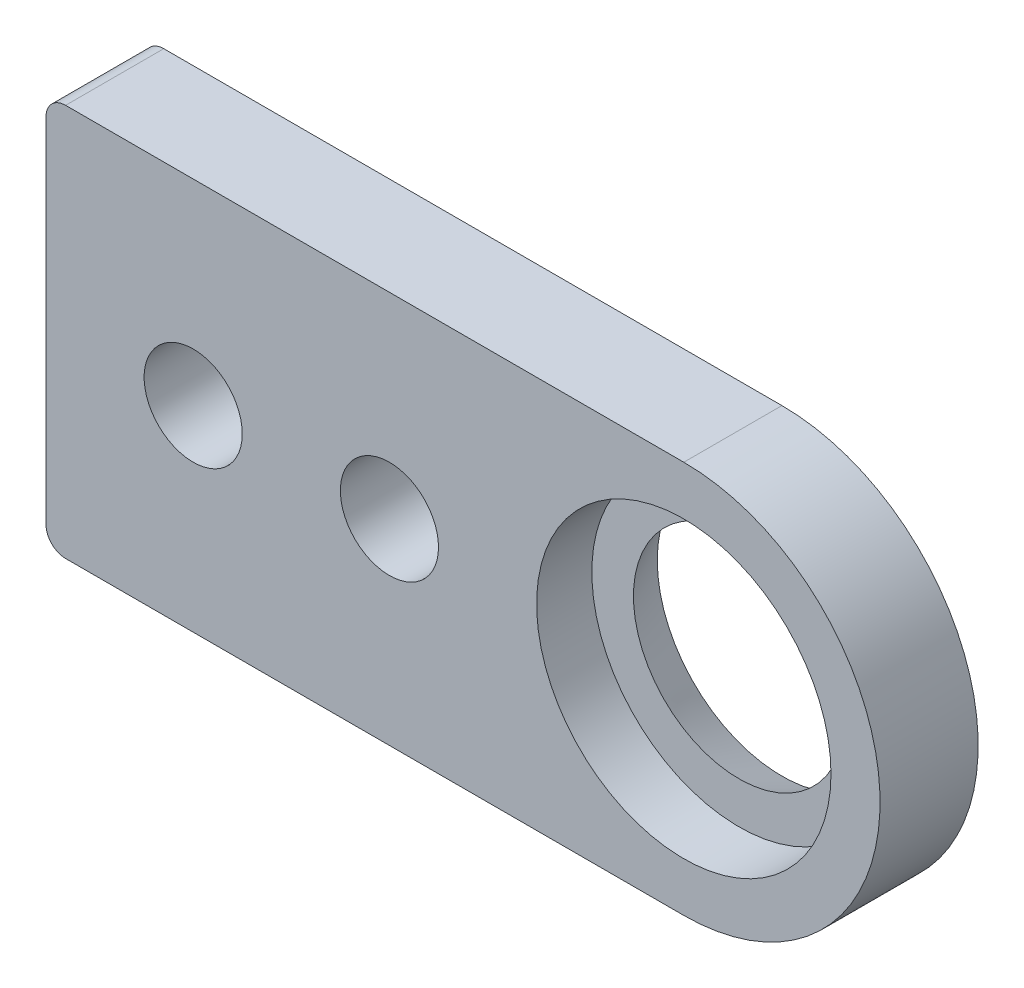
ISO-10303-21;
HEADER;
FILE_DESCRIPTION(('STEP AP214'),'2;1');
FILE_NAME('part.step','',(''),(''),'','','');
FILE_SCHEMA(('AUTOMOTIVE_DESIGN { 1 0 10303 214 1 1 1 1 }'));
ENDSEC;
DATA;
#1=APPLICATION_CONTEXT('core data for automotive mechanical design processes');
#2=APPLICATION_PROTOCOL_DEFINITION('international standard','automotive_design',2000,#1);
#3=PRODUCT_CONTEXT('',#1,'mechanical');
#4=PRODUCT('Part','Part','',(#3));
#5=PRODUCT_RELATED_PRODUCT_CATEGORY('part','',(#4));
#6=PRODUCT_DEFINITION_FORMATION('','',#4);
#7=PRODUCT_DEFINITION_CONTEXT('part definition',#1,'design');
#8=PRODUCT_DEFINITION('design','',#6,#7);
#9=PRODUCT_DEFINITION_SHAPE('','',#8);
#10=(LENGTH_UNIT() NAMED_UNIT(*) SI_UNIT(.MILLI.,.METRE.));
#11=(NAMED_UNIT(*) PLANE_ANGLE_UNIT() SI_UNIT($,.RADIAN.));
#12=(NAMED_UNIT(*) SI_UNIT($,.STERADIAN.) SOLID_ANGLE_UNIT());
#13=UNCERTAINTY_MEASURE_WITH_UNIT(LENGTH_MEASURE(1.E-05),#10,'distance_accuracy_value','');
#14=(GEOMETRIC_REPRESENTATION_CONTEXT(3) GLOBAL_UNCERTAINTY_ASSIGNED_CONTEXT((#13)) GLOBAL_UNIT_ASSIGNED_CONTEXT((#10,
#11,#12)) REPRESENTATION_CONTEXT('',''));
#15=CARTESIAN_POINT('',(0.,0.,0.));
#16=DIRECTION('',(0.,0.,1.));
#17=DIRECTION('',(1.,0.,0.));
#18=AXIS2_PLACEMENT_3D('',#15,#16,#17);
#19=CARTESIAN_POINT('',(0.,0.,6.35));
#20=DIRECTION('',(0.,0.,1.));
#21=DIRECTION('',(1.,0.,0.));
#22=AXIS2_PLACEMENT_3D('',#19,#20,#21);
#23=PLANE('',#22);
#24=CARTESIAN_POINT('',(9.525,-12.7,6.35));
#25=DIRECTION('',(0.,0.,1.));
#26=DIRECTION('',(1.,0.,0.));
#27=AXIS2_PLACEMENT_3D('',#24,#25,#26);
#28=CIRCLE('',#27,3.175);
#29=CARTESIAN_POINT('',(12.7,-12.7,6.35));
#30=VERTEX_POINT('',#29);
#31=EDGE_CURVE('E127',#30,#30,#28,.T.);
#32=ORIENTED_EDGE('',*,*,#31,.F.);
#33=EDGE_LOOP('',(#32));
#34=FACE_BOUND('',#33,.T.);
#35=CARTESIAN_POINT('',(22.225,-12.7,6.35));
#36=DIRECTION('',(0.,0.,1.));
#37=DIRECTION('',(1.,0.,0.));
#38=AXIS2_PLACEMENT_3D('',#35,#36,#37);
#39=CIRCLE('',#38,3.175);
#40=CARTESIAN_POINT('',(25.4,-12.7,6.35));
#41=VERTEX_POINT('',#40);
#42=EDGE_CURVE('E181',#41,#41,#39,.T.);
#43=ORIENTED_EDGE('',*,*,#42,.F.);
#44=EDGE_LOOP('',(#43));
#45=FACE_BOUND('',#44,.T.);
#46=CARTESIAN_POINT('',(41.275,-12.7,6.35));
#47=DIRECTION('',(0.,0.,1.));
#48=DIRECTION('',(1.,0.,0.));
#49=AXIS2_PLACEMENT_3D('',#46,#47,#48);
#50=CIRCLE('',#49,9.52500000000002);
#51=CARTESIAN_POINT('',(50.8,-12.7,6.35));
#52=VERTEX_POINT('',#51);
#53=EDGE_CURVE('E185',#52,#52,#50,.T.);
#54=ORIENTED_EDGE('',*,*,#53,.F.);
#55=EDGE_LOOP('',(#54));
#56=FACE_BOUND('',#55,.T.);
#57=DIRECTION('',(1.,0.,0.));
#58=VECTOR('',#57,1.);
#59=CARTESIAN_POINT('',(0.,-25.4,6.35));
#60=LINE('',#59,#58);
#61=CARTESIAN_POINT('',(1.27,-25.4,6.35));
#62=VERTEX_POINT('',#61);
#63=CARTESIAN_POINT('',(41.275,-25.4,6.35));
#64=VERTEX_POINT('',#63);
#65=EDGE_CURVE('E157',#62,#64,#60,.T.);
#66=ORIENTED_EDGE('',*,*,#65,.T.);
#67=CARTESIAN_POINT('',(41.275,-12.7,6.35));
#68=DIRECTION('',(0.,0.,1.));
#69=DIRECTION('',(1.,0.,0.));
#70=AXIS2_PLACEMENT_3D('',#67,#68,#69);
#71=CIRCLE('',#70,12.7);
#72=CARTESIAN_POINT('',(41.275,0.,6.35));
#73=VERTEX_POINT('',#72);
#74=EDGE_CURVE('E106',#64,#73,#71,.T.);
#75=ORIENTED_EDGE('',*,*,#74,.T.);
#76=DIRECTION('',(1.,0.,0.));
#77=VECTOR('',#76,1.);
#78=CARTESIAN_POINT('',(0.,0.,6.35));
#79=LINE('',#78,#77);
#80=CARTESIAN_POINT('',(1.27,0.,6.35));
#81=VERTEX_POINT('',#80);
#82=EDGE_CURVE('E138',#81,#73,#79,.T.);
#83=ORIENTED_EDGE('',*,*,#82,.F.);
#84=CARTESIAN_POINT('',(1.27,-1.27,6.35));
#85=DIRECTION('',(0.,0.,1.));
#86=DIRECTION('',(1.,0.,0.));
#87=AXIS2_PLACEMENT_3D('',#84,#85,#86);
#88=CIRCLE('',#87,1.27);
#89=CARTESIAN_POINT('',(0.,-1.27,6.35));
#90=VERTEX_POINT('',#89);
#91=EDGE_CURVE('E62',#81,#90,#88,.T.);
#92=ORIENTED_EDGE('',*,*,#91,.T.);
#93=DIRECTION('',(0.,1.,0.));
#94=VECTOR('',#93,1.);
#95=CARTESIAN_POINT('',(0.,0.,6.35));
#96=LINE('',#95,#94);
#97=CARTESIAN_POINT('',(0.,-24.13,6.35));
#98=VERTEX_POINT('',#97);
#99=EDGE_CURVE('E158',#98,#90,#96,.T.);
#100=ORIENTED_EDGE('',*,*,#99,.F.);
#101=CARTESIAN_POINT('',(1.27,-24.13,6.35));
#102=DIRECTION('',(0.,0.,1.));
#103=DIRECTION('',(1.,0.,0.));
#104=AXIS2_PLACEMENT_3D('',#101,#102,#103);
#105=CIRCLE('',#104,1.27);
#106=EDGE_CURVE('E50',#98,#62,#105,.T.);
#107=ORIENTED_EDGE('',*,*,#106,.T.);
#108=EDGE_LOOP('',(#66,#75,#83,#92,#100,#107));
#109=FACE_BOUND('',#108,.T.);
#110=ADVANCED_FACE('F41',(#34,#45,#56,#109),#23,.T.);
#111=CARTESIAN_POINT('',(0.,0.,0.));
#112=DIRECTION('',(0.,0.,1.));
#113=DIRECTION('',(1.,0.,0.));
#114=AXIS2_PLACEMENT_3D('',#111,#112,#113);
#115=PLANE('',#114);
#116=CARTESIAN_POINT('',(41.275,-12.7,0.));
#117=DIRECTION('',(0.,0.,1.));
#118=DIRECTION('',(1.,0.,0.));
#119=AXIS2_PLACEMENT_3D('',#116,#117,#118);
#120=CIRCLE('',#119,8.06821118956825);
#121=CARTESIAN_POINT('',(49.3432111895683,-12.7,0.));
#122=VERTEX_POINT('',#121);
#123=EDGE_CURVE('E116',#122,#122,#120,.T.);
#124=ORIENTED_EDGE('',*,*,#123,.T.);
#125=EDGE_LOOP('',(#124));
#126=FACE_BOUND('',#125,.T.);
#127=CARTESIAN_POINT('',(9.525,-12.7,0.));
#128=DIRECTION('',(0.,0.,1.));
#129=DIRECTION('',(1.,0.,0.));
#130=AXIS2_PLACEMENT_3D('',#127,#128,#129);
#131=CIRCLE('',#130,3.175);
#132=CARTESIAN_POINT('',(12.7,-12.7,0.));
#133=VERTEX_POINT('',#132);
#134=EDGE_CURVE('E171',#133,#133,#131,.T.);
#135=ORIENTED_EDGE('',*,*,#134,.T.);
#136=EDGE_LOOP('',(#135));
#137=FACE_BOUND('',#136,.T.);
#138=CARTESIAN_POINT('',(22.225,-12.7,0.));
#139=DIRECTION('',(0.,0.,1.));
#140=DIRECTION('',(1.,0.,0.));
#141=AXIS2_PLACEMENT_3D('',#138,#139,#140);
#142=CIRCLE('',#141,3.175);
#143=CARTESIAN_POINT('',(25.4,-12.7,0.));
#144=VERTEX_POINT('',#143);
#145=EDGE_CURVE('E130',#144,#144,#142,.T.);
#146=ORIENTED_EDGE('',*,*,#145,.T.);
#147=EDGE_LOOP('',(#146));
#148=FACE_BOUND('',#147,.T.);
#149=CARTESIAN_POINT('',(41.275,-12.7,0.));
#150=DIRECTION('',(0.,0.,1.));
#151=DIRECTION('',(1.,0.,0.));
#152=AXIS2_PLACEMENT_3D('',#149,#150,#151);
#153=CIRCLE('',#152,12.7);
#154=CARTESIAN_POINT('',(41.275,-25.4,0.));
#155=VERTEX_POINT('',#154);
#156=CARTESIAN_POINT('',(41.275,0.,0.));
#157=VERTEX_POINT('',#156);
#158=EDGE_CURVE('E96',#155,#157,#153,.T.);
#159=ORIENTED_EDGE('',*,*,#158,.F.);
#160=DIRECTION('',(1.,0.,0.));
#161=VECTOR('',#160,1.);
#162=CARTESIAN_POINT('',(0.,-25.4,0.));
#163=LINE('',#162,#161);
#164=CARTESIAN_POINT('',(1.27,-25.4,0.));
#165=VERTEX_POINT('',#164);
#166=EDGE_CURVE('E100',#165,#155,#163,.T.);
#167=ORIENTED_EDGE('',*,*,#166,.F.);
#168=CARTESIAN_POINT('',(1.27,-24.13,0.));
#169=DIRECTION('',(0.,0.,1.));
#170=DIRECTION('',(1.,0.,0.));
#171=AXIS2_PLACEMENT_3D('',#168,#169,#170);
#172=CIRCLE('',#171,1.27);
#173=CARTESIAN_POINT('',(0.,-24.13,0.));
#174=VERTEX_POINT('',#173);
#175=EDGE_CURVE('E144',#165,#174,#172,.F.);
#176=ORIENTED_EDGE('',*,*,#175,.T.);
#177=DIRECTION('',(0.,1.,0.));
#178=VECTOR('',#177,1.);
#179=CARTESIAN_POINT('',(0.,0.,0.));
#180=LINE('',#179,#178);
#181=CARTESIAN_POINT('',(0.,-1.27,0.));
#182=VERTEX_POINT('',#181);
#183=EDGE_CURVE('E123',#174,#182,#180,.T.);
#184=ORIENTED_EDGE('',*,*,#183,.T.);
#185=CARTESIAN_POINT('',(1.27,-1.27,0.));
#186=DIRECTION('',(0.,0.,1.));
#187=DIRECTION('',(1.,0.,0.));
#188=AXIS2_PLACEMENT_3D('',#185,#186,#187);
#189=CIRCLE('',#188,1.27);
#190=CARTESIAN_POINT('',(1.27,0.,0.));
#191=VERTEX_POINT('',#190);
#192=EDGE_CURVE('E141',#182,#191,#189,.F.);
#193=ORIENTED_EDGE('',*,*,#192,.T.);
#194=DIRECTION('',(1.,0.,0.));
#195=VECTOR('',#194,1.);
#196=CARTESIAN_POINT('',(0.,0.,0.));
#197=LINE('',#196,#195);
#198=EDGE_CURVE('E101',#191,#157,#197,.T.);
#199=ORIENTED_EDGE('',*,*,#198,.T.);
#200=EDGE_LOOP('',(#159,#167,#176,#184,#193,#199));
#201=FACE_BOUND('',#200,.T.);
#202=ADVANCED_FACE('F98',(#126,#137,#148,#201),#115,.F.);
#203=CARTESIAN_POINT('',(0.,0.,6.35));
#204=DIRECTION('',(-1.,0.,0.));
#205=DIRECTION('',(0.,0.,1.));
#206=AXIS2_PLACEMENT_3D('',#203,#204,#205);
#207=PLANE('',#206);
#208=ORIENTED_EDGE('',*,*,#183,.F.);
#209=DIRECTION('',(0.,0.,-1.));
#210=VECTOR('',#209,1.);
#211=CARTESIAN_POINT('',(0.,-24.13,6.35));
#212=LINE('',#211,#210);
#213=EDGE_CURVE('E151',#174,#98,#212,.F.);
#214=ORIENTED_EDGE('',*,*,#213,.T.);
#215=ORIENTED_EDGE('',*,*,#99,.T.);
#216=DIRECTION('',(0.,0.,-1.));
#217=VECTOR('',#216,1.);
#218=CARTESIAN_POINT('',(0.,-1.27,6.35));
#219=LINE('',#218,#217);
#220=EDGE_CURVE('E147',#90,#182,#219,.T.);
#221=ORIENTED_EDGE('',*,*,#220,.T.);
#222=EDGE_LOOP('',(#208,#214,#215,#221));
#223=FACE_BOUND('',#222,.T.);
#224=ADVANCED_FACE('F166',(#223),#207,.T.);
#225=CARTESIAN_POINT('',(0.,-25.4,6.35));
#226=DIRECTION('',(0.,1.,0.));
#227=DIRECTION('',(0.,0.,1.));
#228=AXIS2_PLACEMENT_3D('',#225,#226,#227);
#229=PLANE('',#228);
#230=ORIENTED_EDGE('',*,*,#166,.T.);
#231=DIRECTION('',(0.,0.,1.));
#232=VECTOR('',#231,1.);
#233=CARTESIAN_POINT('',(41.275,-25.4,0.));
#234=LINE('',#233,#232);
#235=EDGE_CURVE('E109',#155,#64,#234,.T.);
#236=ORIENTED_EDGE('',*,*,#235,.T.);
#237=ORIENTED_EDGE('',*,*,#65,.F.);
#238=DIRECTION('',(0.,0.,-1.));
#239=VECTOR('',#238,1.);
#240=CARTESIAN_POINT('',(1.27,-25.4,0.));
#241=LINE('',#240,#239);
#242=EDGE_CURVE('E121',#62,#165,#241,.T.);
#243=ORIENTED_EDGE('',*,*,#242,.T.);
#244=EDGE_LOOP('',(#230,#236,#237,#243));
#245=FACE_BOUND('',#244,.T.);
#246=ADVANCED_FACE('F119',(#245),#229,.F.);
#247=CARTESIAN_POINT('',(41.275,-12.7,6.35));
#248=DIRECTION('',(0.,0.,-1.));
#249=DIRECTION('',(-1.,0.,0.));
#250=AXIS2_PLACEMENT_3D('',#247,#248,#249);
#251=CYLINDRICAL_SURFACE('',#250,9.52500000000002);
#252=CARTESIAN_POINT('',(41.275,-12.7,2.778125));
#253=DIRECTION('',(0.,0.,1.));
#254=DIRECTION('',(1.,0.,0.));
#255=AXIS2_PLACEMENT_3D('',#252,#253,#254);
#256=CIRCLE('',#255,9.52500000000002);
#257=CARTESIAN_POINT('',(50.8,-12.7,2.778125));
#258=VERTEX_POINT('',#257);
#259=EDGE_CURVE('E134',#258,#258,#256,.T.);
#260=ORIENTED_EDGE('',*,*,#259,.F.);
#261=EDGE_LOOP('',(#260));
#262=FACE_BOUND('',#261,.T.);
#263=ORIENTED_EDGE('',*,*,#53,.T.);
#264=EDGE_LOOP('',(#263));
#265=FACE_BOUND('',#264,.T.);
#266=ADVANCED_FACE('F200',(#262,#265),#251,.F.);
#267=CARTESIAN_POINT('',(22.225,-12.7,6.35));
#268=DIRECTION('',(0.,0.,-1.));
#269=DIRECTION('',(-1.,0.,0.));
#270=AXIS2_PLACEMENT_3D('',#267,#268,#269);
#271=CYLINDRICAL_SURFACE('',#270,3.175);
#272=ORIENTED_EDGE('',*,*,#42,.T.);
#273=EDGE_LOOP('',(#272));
#274=FACE_BOUND('',#273,.T.);
#275=ORIENTED_EDGE('',*,*,#145,.F.);
#276=EDGE_LOOP('',(#275));
#277=FACE_BOUND('',#276,.T.);
#278=ADVANCED_FACE('F197',(#274,#277),#271,.F.);
#279=CARTESIAN_POINT('',(9.525,-12.7,6.35));
#280=DIRECTION('',(0.,0.,-1.));
#281=DIRECTION('',(-1.,0.,0.));
#282=AXIS2_PLACEMENT_3D('',#279,#280,#281);
#283=CYLINDRICAL_SURFACE('',#282,3.175);
#284=ORIENTED_EDGE('',*,*,#31,.T.);
#285=EDGE_LOOP('',(#284));
#286=FACE_BOUND('',#285,.T.);
#287=ORIENTED_EDGE('',*,*,#134,.F.);
#288=EDGE_LOOP('',(#287));
#289=FACE_BOUND('',#288,.T.);
#290=ADVANCED_FACE('F199',(#286,#289),#283,.F.);
#291=CARTESIAN_POINT('',(0.,0.,6.35));
#292=DIRECTION('',(0.,1.,0.));
#293=DIRECTION('',(0.,0.,1.));
#294=AXIS2_PLACEMENT_3D('',#291,#292,#293);
#295=PLANE('',#294);
#296=DIRECTION('',(0.,0.,1.));
#297=VECTOR('',#296,1.);
#298=CARTESIAN_POINT('',(41.275,0.,0.));
#299=LINE('',#298,#297);
#300=EDGE_CURVE('E105',#157,#73,#299,.T.);
#301=ORIENTED_EDGE('',*,*,#300,.F.);
#302=ORIENTED_EDGE('',*,*,#198,.F.);
#303=DIRECTION('',(0.,0.,-1.));
#304=VECTOR('',#303,1.);
#305=CARTESIAN_POINT('',(1.27,0.,6.35));
#306=LINE('',#305,#304);
#307=EDGE_CURVE('E11',#191,#81,#306,.F.);
#308=ORIENTED_EDGE('',*,*,#307,.T.);
#309=ORIENTED_EDGE('',*,*,#82,.T.);
#310=EDGE_LOOP('',(#301,#302,#308,#309));
#311=FACE_BOUND('',#310,.T.);
#312=ADVANCED_FACE('F169',(#311),#295,.T.);
#313=CARTESIAN_POINT('',(0.,0.,2.778125));
#314=DIRECTION('',(0.,0.,1.));
#315=DIRECTION('',(1.,0.,0.));
#316=AXIS2_PLACEMENT_3D('',#313,#314,#315);
#317=PLANE('',#316);
#318=CARTESIAN_POINT('',(41.275,-12.7,2.778125));
#319=DIRECTION('',(0.,0.,1.));
#320=DIRECTION('',(1.,0.,0.));
#321=AXIS2_PLACEMENT_3D('',#318,#319,#320);
#322=CIRCLE('',#321,6.83131024819549);
#323=CARTESIAN_POINT('',(48.1063102481955,-12.7,2.778125));
#324=VERTEX_POINT('',#323);
#325=EDGE_CURVE('E330',#324,#324,#322,.T.);
#326=ORIENTED_EDGE('',*,*,#325,.F.);
#327=EDGE_LOOP('',(#326));
#328=FACE_BOUND('',#327,.T.);
#329=ORIENTED_EDGE('',*,*,#259,.T.);
#330=EDGE_LOOP('',(#329));
#331=FACE_BOUND('',#330,.T.);
#332=ADVANCED_FACE('F222',(#328,#331),#317,.T.);
#333=CARTESIAN_POINT('',(1.27,-24.13,6.35));
#334=DIRECTION('',(0.,0.,1.));
#335=DIRECTION('',(1.,0.,0.));
#336=AXIS2_PLACEMENT_3D('',#333,#334,#335);
#337=CYLINDRICAL_SURFACE('',#336,1.27);
#338=ORIENTED_EDGE('',*,*,#106,.F.);
#339=ORIENTED_EDGE('',*,*,#213,.F.);
#340=ORIENTED_EDGE('',*,*,#175,.F.);
#341=ORIENTED_EDGE('',*,*,#242,.F.);
#342=EDGE_LOOP('',(#338,#339,#340,#341));
#343=FACE_BOUND('',#342,.T.);
#344=ADVANCED_FACE('F163',(#343),#337,.T.);
#345=CARTESIAN_POINT('',(1.27,-1.27,6.35));
#346=DIRECTION('',(0.,0.,-1.));
#347=DIRECTION('',(-1.,0.,0.));
#348=AXIS2_PLACEMENT_3D('',#345,#346,#347);
#349=CYLINDRICAL_SURFACE('',#348,1.27);
#350=ORIENTED_EDGE('',*,*,#91,.F.);
#351=ORIENTED_EDGE('',*,*,#307,.F.);
#352=ORIENTED_EDGE('',*,*,#192,.F.);
#353=ORIENTED_EDGE('',*,*,#220,.F.);
#354=EDGE_LOOP('',(#350,#351,#352,#353));
#355=FACE_BOUND('',#354,.T.);
#356=ADVANCED_FACE('F43',(#355),#349,.T.);
#357=CARTESIAN_POINT('',(41.275,-12.7,0.));
#358=DIRECTION('',(0.,0.,1.));
#359=DIRECTION('',(1.,0.,0.));
#360=AXIS2_PLACEMENT_3D('',#357,#358,#359);
#361=CYLINDRICAL_SURFACE('',#360,12.7);
#362=ORIENTED_EDGE('',*,*,#74,.F.);
#363=ORIENTED_EDGE('',*,*,#235,.F.);
#364=ORIENTED_EDGE('',*,*,#158,.T.);
#365=ORIENTED_EDGE('',*,*,#300,.T.);
#366=EDGE_LOOP('',(#362,#363,#364,#365));
#367=FACE_BOUND('',#366,.T.);
#368=ADVANCED_FACE('F110',(#367),#361,.T.);
#369=CARTESIAN_POINT('',(41.275,-12.7,0.));
#370=DIRECTION('',(0.,0.,-1.));
#371=DIRECTION('',(-1.,0.,0.));
#372=AXIS2_PLACEMENT_3D('',#369,#370,#371);
#373=CONICAL_SURFACE('',#372,8.06821118956825,0.418879020478633);
#374=ORIENTED_EDGE('',*,*,#325,.T.);
#375=EDGE_LOOP('',(#374));
#376=FACE_BOUND('',#375,.T.);
#377=ORIENTED_EDGE('',*,*,#123,.F.);
#378=EDGE_LOOP('',(#377));
#379=FACE_BOUND('',#378,.T.);
#380=ADVANCED_FACE('F281',(#376,#379),#373,.F.);
#381=CLOSED_SHELL('',(#110,#202,#224,#246,#266,#278,#290,#312,#332,#344,#356,#368,#380));
#382=MANIFOLD_SOLID_BREP('B2',#381);
#383=ADVANCED_BREP_SHAPE_REPRESENTATION('',(#18,#382),#14);
#384=SHAPE_DEFINITION_REPRESENTATION(#9,#383);
ENDSEC;
END-ISO-10303-21;
